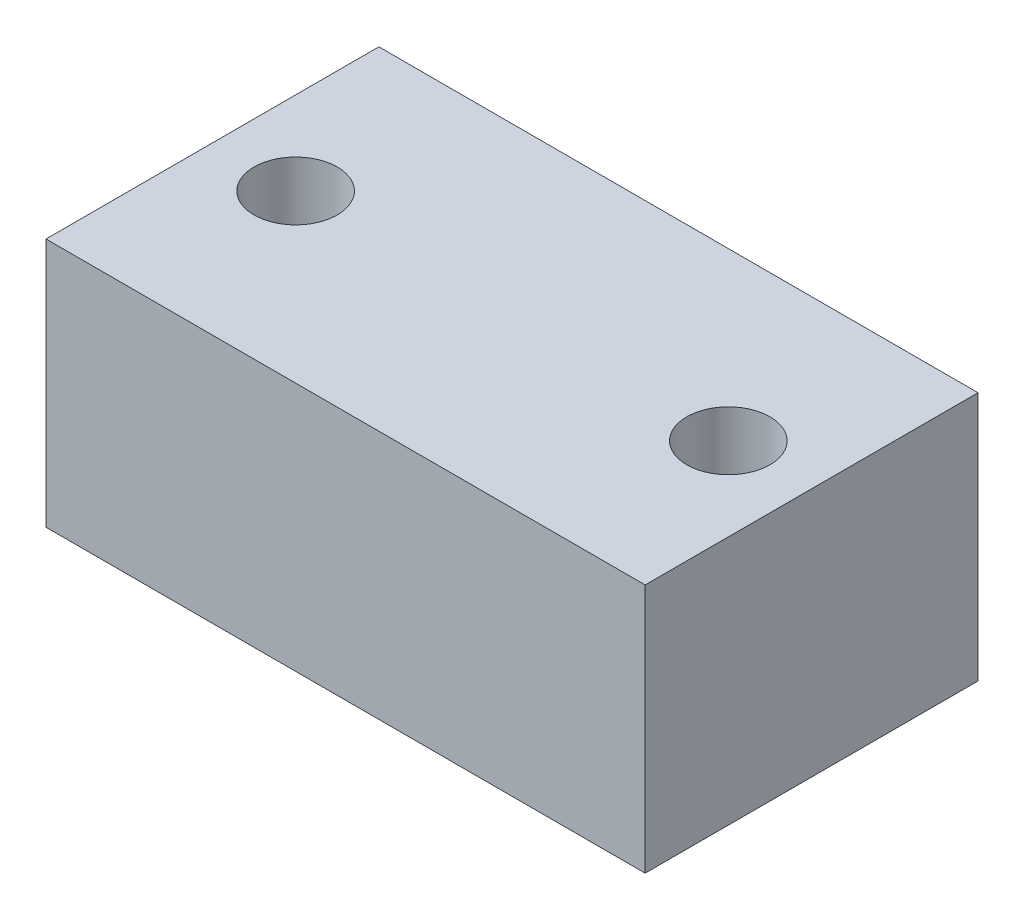
ISO-10303-21;
HEADER;
FILE_DESCRIPTION(('STEP AP214'),'2;1');
FILE_NAME('part.step','',(''),(''),'','','');
FILE_SCHEMA(('AUTOMOTIVE_DESIGN { 1 0 10303 214 1 1 1 1 }'));
ENDSEC;
DATA;
#1=APPLICATION_CONTEXT('core data for automotive mechanical design processes');
#2=APPLICATION_PROTOCOL_DEFINITION('international standard','automotive_design',2000,#1);
#3=PRODUCT_CONTEXT('',#1,'mechanical');
#4=PRODUCT('Part','Part','',(#3));
#5=PRODUCT_RELATED_PRODUCT_CATEGORY('part','',(#4));
#6=PRODUCT_DEFINITION_FORMATION('','',#4);
#7=PRODUCT_DEFINITION_CONTEXT('part definition',#1,'design');
#8=PRODUCT_DEFINITION('design','',#6,#7);
#9=PRODUCT_DEFINITION_SHAPE('','',#8);
#10=(LENGTH_UNIT() NAMED_UNIT(*) SI_UNIT(.MILLI.,.METRE.));
#11=(NAMED_UNIT(*) PLANE_ANGLE_UNIT() SI_UNIT($,.RADIAN.));
#12=(NAMED_UNIT(*) SI_UNIT($,.STERADIAN.) SOLID_ANGLE_UNIT());
#13=UNCERTAINTY_MEASURE_WITH_UNIT(LENGTH_MEASURE(1.E-05),#10,'distance_accuracy_value','');
#14=(GEOMETRIC_REPRESENTATION_CONTEXT(3) GLOBAL_UNCERTAINTY_ASSIGNED_CONTEXT((#13)) GLOBAL_UNIT_ASSIGNED_CONTEXT((#10,
#11,#12)) REPRESENTATION_CONTEXT('',''));
#15=CARTESIAN_POINT('',(0.,0.,0.));
#16=DIRECTION('',(0.,0.,1.));
#17=DIRECTION('',(1.,0.,0.));
#18=AXIS2_PLACEMENT_3D('',#15,#16,#17);
#19=CARTESIAN_POINT('',(18.,15.,-10.));
#20=DIRECTION('',(-1.,0.,0.));
#21=DIRECTION('',(0.,0.,1.));
#22=AXIS2_PLACEMENT_3D('',#19,#20,#21);
#23=PLANE('',#22);
#24=DIRECTION('',(0.,0.,-1.));
#25=VECTOR('',#24,1.);
#26=CARTESIAN_POINT('',(18.,0.,-10.));
#27=LINE('',#26,#25);
#28=CARTESIAN_POINT('',(18.,0.,10.));
#29=VERTEX_POINT('',#28);
#30=CARTESIAN_POINT('',(18.,0.,-10.));
#31=VERTEX_POINT('',#30);
#32=EDGE_CURVE('E107',#29,#31,#27,.T.);
#33=ORIENTED_EDGE('',*,*,#32,.T.);
#34=DIRECTION('',(0.,-1.,0.));
#35=VECTOR('',#34,1.);
#36=CARTESIAN_POINT('',(18.,15.,-10.));
#37=LINE('',#36,#35);
#38=CARTESIAN_POINT('',(18.,15.,-10.));
#39=VERTEX_POINT('',#38);
#40=EDGE_CURVE('E11',#39,#31,#37,.T.);
#41=ORIENTED_EDGE('',*,*,#40,.F.);
#42=DIRECTION('',(0.,0.,-1.));
#43=VECTOR('',#42,1.);
#44=CARTESIAN_POINT('',(18.,15.,-10.));
#45=LINE('',#44,#43);
#46=CARTESIAN_POINT('',(18.,15.,10.));
#47=VERTEX_POINT('',#46);
#48=EDGE_CURVE('E91',#47,#39,#45,.T.);
#49=ORIENTED_EDGE('',*,*,#48,.F.);
#50=DIRECTION('',(0.,-1.,0.));
#51=VECTOR('',#50,1.);
#52=CARTESIAN_POINT('',(18.,15.,10.));
#53=LINE('',#52,#51);
#54=EDGE_CURVE('E103',#47,#29,#53,.T.);
#55=ORIENTED_EDGE('',*,*,#54,.T.);
#56=EDGE_LOOP('',(#33,#41,#49,#55));
#57=FACE_BOUND('',#56,.T.);
#58=ADVANCED_FACE('F39',(#57),#23,.F.);
#59=CARTESIAN_POINT('',(-18.,15.,-10.));
#60=DIRECTION('',(0.,0.,1.));
#61=DIRECTION('',(1.,0.,0.));
#62=AXIS2_PLACEMENT_3D('',#59,#60,#61);
#63=PLANE('',#62);
#64=DIRECTION('',(-1.,0.,0.));
#65=VECTOR('',#64,1.);
#66=CARTESIAN_POINT('',(-18.,0.,-10.));
#67=LINE('',#66,#65);
#68=CARTESIAN_POINT('',(-18.,0.,-10.));
#69=VERTEX_POINT('',#68);
#70=EDGE_CURVE('E96',#31,#69,#67,.T.);
#71=ORIENTED_EDGE('',*,*,#70,.T.);
#72=DIRECTION('',(0.,-1.,0.));
#73=VECTOR('',#72,1.);
#74=CARTESIAN_POINT('',(-18.,15.,-10.));
#75=LINE('',#74,#73);
#76=CARTESIAN_POINT('',(-18.,15.,-10.));
#77=VERTEX_POINT('',#76);
#78=EDGE_CURVE('E48',#77,#69,#75,.T.);
#79=ORIENTED_EDGE('',*,*,#78,.F.);
#80=DIRECTION('',(-1.,0.,0.));
#81=VECTOR('',#80,1.);
#82=CARTESIAN_POINT('',(-18.,15.,-10.));
#83=LINE('',#82,#81);
#84=EDGE_CURVE('E86',#39,#77,#83,.T.);
#85=ORIENTED_EDGE('',*,*,#84,.F.);
#86=ORIENTED_EDGE('',*,*,#40,.T.);
#87=EDGE_LOOP('',(#71,#79,#85,#86));
#88=FACE_BOUND('',#87,.T.);
#89=ADVANCED_FACE('F95',(#88),#63,.F.);
#90=CARTESIAN_POINT('',(-18.,15.,-10.));
#91=DIRECTION('',(1.,0.,0.));
#92=DIRECTION('',(0.,0.,-1.));
#93=AXIS2_PLACEMENT_3D('',#90,#91,#92);
#94=PLANE('',#93);
#95=DIRECTION('',(0.,0.,1.));
#96=VECTOR('',#95,1.);
#97=CARTESIAN_POINT('',(-18.,0.,-10.));
#98=LINE('',#97,#96);
#99=CARTESIAN_POINT('',(-18.,0.,10.));
#100=VERTEX_POINT('',#99);
#101=EDGE_CURVE('E73',#69,#100,#98,.T.);
#102=ORIENTED_EDGE('',*,*,#101,.T.);
#103=DIRECTION('',(0.,-1.,0.));
#104=VECTOR('',#103,1.);
#105=CARTESIAN_POINT('',(-18.,15.,10.));
#106=LINE('',#105,#104);
#107=CARTESIAN_POINT('',(-18.,15.,10.));
#108=VERTEX_POINT('',#107);
#109=EDGE_CURVE('E98',#108,#100,#106,.T.);
#110=ORIENTED_EDGE('',*,*,#109,.F.);
#111=DIRECTION('',(0.,0.,1.));
#112=VECTOR('',#111,1.);
#113=CARTESIAN_POINT('',(-18.,15.,-10.));
#114=LINE('',#113,#112);
#115=EDGE_CURVE('E89',#77,#108,#114,.T.);
#116=ORIENTED_EDGE('',*,*,#115,.F.);
#117=ORIENTED_EDGE('',*,*,#78,.T.);
#118=EDGE_LOOP('',(#102,#110,#116,#117));
#119=FACE_BOUND('',#118,.T.);
#120=ADVANCED_FACE('F99',(#119),#94,.F.);
#121=CARTESIAN_POINT('',(-18.,15.,10.));
#122=DIRECTION('',(0.,0.,-1.));
#123=DIRECTION('',(-1.,0.,0.));
#124=AXIS2_PLACEMENT_3D('',#121,#122,#123);
#125=PLANE('',#124);
#126=DIRECTION('',(1.,0.,0.));
#127=VECTOR('',#126,1.);
#128=CARTESIAN_POINT('',(-18.,0.,10.));
#129=LINE('',#128,#127);
#130=EDGE_CURVE('E79',#100,#29,#129,.T.);
#131=ORIENTED_EDGE('',*,*,#130,.T.);
#132=ORIENTED_EDGE('',*,*,#54,.F.);
#133=DIRECTION('',(1.,0.,0.));
#134=VECTOR('',#133,1.);
#135=CARTESIAN_POINT('',(-18.,15.,10.));
#136=LINE('',#135,#134);
#137=EDGE_CURVE('E56',#108,#47,#136,.T.);
#138=ORIENTED_EDGE('',*,*,#137,.F.);
#139=ORIENTED_EDGE('',*,*,#109,.T.);
#140=EDGE_LOOP('',(#131,#132,#138,#139));
#141=FACE_BOUND('',#140,.T.);
#142=ADVANCED_FACE('F121',(#141),#125,.F.);
#143=CARTESIAN_POINT('',(0.,15.,0.));
#144=DIRECTION('',(0.,1.,0.));
#145=DIRECTION('',(0.,0.,1.));
#146=AXIS2_PLACEMENT_3D('',#143,#144,#145);
#147=PLANE('',#146);
#148=CARTESIAN_POINT('',(13.,15.,0.));
#149=DIRECTION('',(0.,1.,0.));
#150=DIRECTION('',(0.,0.,1.));
#151=AXIS2_PLACEMENT_3D('',#148,#149,#150);
#152=CIRCLE('',#151,2.5);
#153=CARTESIAN_POINT('',(13.,15.,2.5));
#154=VERTEX_POINT('',#153);
#155=EDGE_CURVE('E136',#154,#154,#152,.T.);
#156=ORIENTED_EDGE('',*,*,#155,.F.);
#157=EDGE_LOOP('',(#156));
#158=FACE_BOUND('',#157,.T.);
#159=CARTESIAN_POINT('',(-13.,15.,0.));
#160=DIRECTION('',(0.,1.,0.));
#161=DIRECTION('',(0.,0.,-1.));
#162=AXIS2_PLACEMENT_3D('',#159,#160,#161);
#163=CIRCLE('',#162,2.5);
#164=CARTESIAN_POINT('',(-13.,15.,-2.5));
#165=VERTEX_POINT('',#164);
#166=EDGE_CURVE('E128',#165,#165,#163,.T.);
#167=ORIENTED_EDGE('',*,*,#166,.F.);
#168=EDGE_LOOP('',(#167));
#169=FACE_BOUND('',#168,.T.);
#170=ORIENTED_EDGE('',*,*,#48,.T.);
#171=ORIENTED_EDGE('',*,*,#84,.T.);
#172=ORIENTED_EDGE('',*,*,#115,.T.);
#173=ORIENTED_EDGE('',*,*,#137,.T.);
#174=EDGE_LOOP('',(#170,#171,#172,#173));
#175=FACE_BOUND('',#174,.T.);
#176=ADVANCED_FACE('F87',(#158,#169,#175),#147,.T.);
#177=CARTESIAN_POINT('',(0.,0.,0.));
#178=DIRECTION('',(0.,1.,0.));
#179=DIRECTION('',(0.,0.,1.));
#180=AXIS2_PLACEMENT_3D('',#177,#178,#179);
#181=PLANE('',#180);
#182=ORIENTED_EDGE('',*,*,#32,.F.);
#183=ORIENTED_EDGE('',*,*,#130,.F.);
#184=ORIENTED_EDGE('',*,*,#101,.F.);
#185=ORIENTED_EDGE('',*,*,#70,.F.);
#186=EDGE_LOOP('',(#182,#183,#184,#185));
#187=FACE_BOUND('',#186,.T.);
#188=ADVANCED_FACE('F124',(#187),#181,.F.);
#189=CARTESIAN_POINT('',(-13.,5.,0.));
#190=DIRECTION('',(0.,1.,0.));
#191=DIRECTION('',(0.,0.,1.));
#192=AXIS2_PLACEMENT_3D('',#189,#190,#191);
#193=CYLINDRICAL_SURFACE('',#192,2.5);
#194=CARTESIAN_POINT('',(-13.,5.,0.));
#195=DIRECTION('',(0.,1.,0.));
#196=DIRECTION('',(0.,0.,-1.));
#197=AXIS2_PLACEMENT_3D('',#194,#195,#196);
#198=CIRCLE('',#197,2.5);
#199=CARTESIAN_POINT('',(-13.,5.,-2.5));
#200=VERTEX_POINT('',#199);
#201=EDGE_CURVE('E132',#200,#200,#198,.T.);
#202=ORIENTED_EDGE('',*,*,#201,.F.);
#203=EDGE_LOOP('',(#202));
#204=FACE_BOUND('',#203,.T.);
#205=ORIENTED_EDGE('',*,*,#166,.T.);
#206=EDGE_LOOP('',(#205));
#207=FACE_BOUND('',#206,.T.);
#208=ADVANCED_FACE('F158',(#204,#207),#193,.F.);
#209=CARTESIAN_POINT('',(-13.,5.,0.));
#210=DIRECTION('',(0.,-1.,0.));
#211=DIRECTION('',(0.,0.,-1.));
#212=AXIS2_PLACEMENT_3D('',#209,#210,#211);
#213=PLANE('',#212);
#214=ORIENTED_EDGE('',*,*,#201,.T.);
#215=EDGE_LOOP('',(#214));
#216=FACE_BOUND('',#215,.T.);
#217=ADVANCED_FACE('F149',(#216),#213,.F.);
#218=CARTESIAN_POINT('',(13.,5.,0.));
#219=DIRECTION('',(0.,1.,0.));
#220=DIRECTION('',(0.,0.,1.));
#221=AXIS2_PLACEMENT_3D('',#218,#219,#220);
#222=CYLINDRICAL_SURFACE('',#221,2.5);
#223=CARTESIAN_POINT('',(13.,5.,0.));
#224=DIRECTION('',(0.,1.,0.));
#225=DIRECTION('',(0.,0.,1.));
#226=AXIS2_PLACEMENT_3D('',#223,#224,#225);
#227=CIRCLE('',#226,2.5);
#228=CARTESIAN_POINT('',(13.,5.,2.5));
#229=VERTEX_POINT('',#228);
#230=EDGE_CURVE('E111',#229,#229,#227,.T.);
#231=ORIENTED_EDGE('',*,*,#230,.F.);
#232=EDGE_LOOP('',(#231));
#233=FACE_BOUND('',#232,.T.);
#234=ORIENTED_EDGE('',*,*,#155,.T.);
#235=EDGE_LOOP('',(#234));
#236=FACE_BOUND('',#235,.T.);
#237=ADVANCED_FACE('F146',(#233,#236),#222,.F.);
#238=CARTESIAN_POINT('',(13.,5.,0.));
#239=DIRECTION('',(0.,1.,0.));
#240=DIRECTION('',(0.,0.,1.));
#241=AXIS2_PLACEMENT_3D('',#238,#239,#240);
#242=PLANE('',#241);
#243=ORIENTED_EDGE('',*,*,#230,.T.);
#244=EDGE_LOOP('',(#243));
#245=FACE_BOUND('',#244,.T.);
#246=ADVANCED_FACE('F144',(#245),#242,.T.);
#247=CLOSED_SHELL('',(#58,#89,#120,#142,#176,#188,#208,#217,#237,#246));
#248=MANIFOLD_SOLID_BREP('B2',#247);
#249=ADVANCED_BREP_SHAPE_REPRESENTATION('',(#18,#248),#14);
#250=SHAPE_DEFINITION_REPRESENTATION(#9,#249);
ENDSEC;
END-ISO-10303-21;
